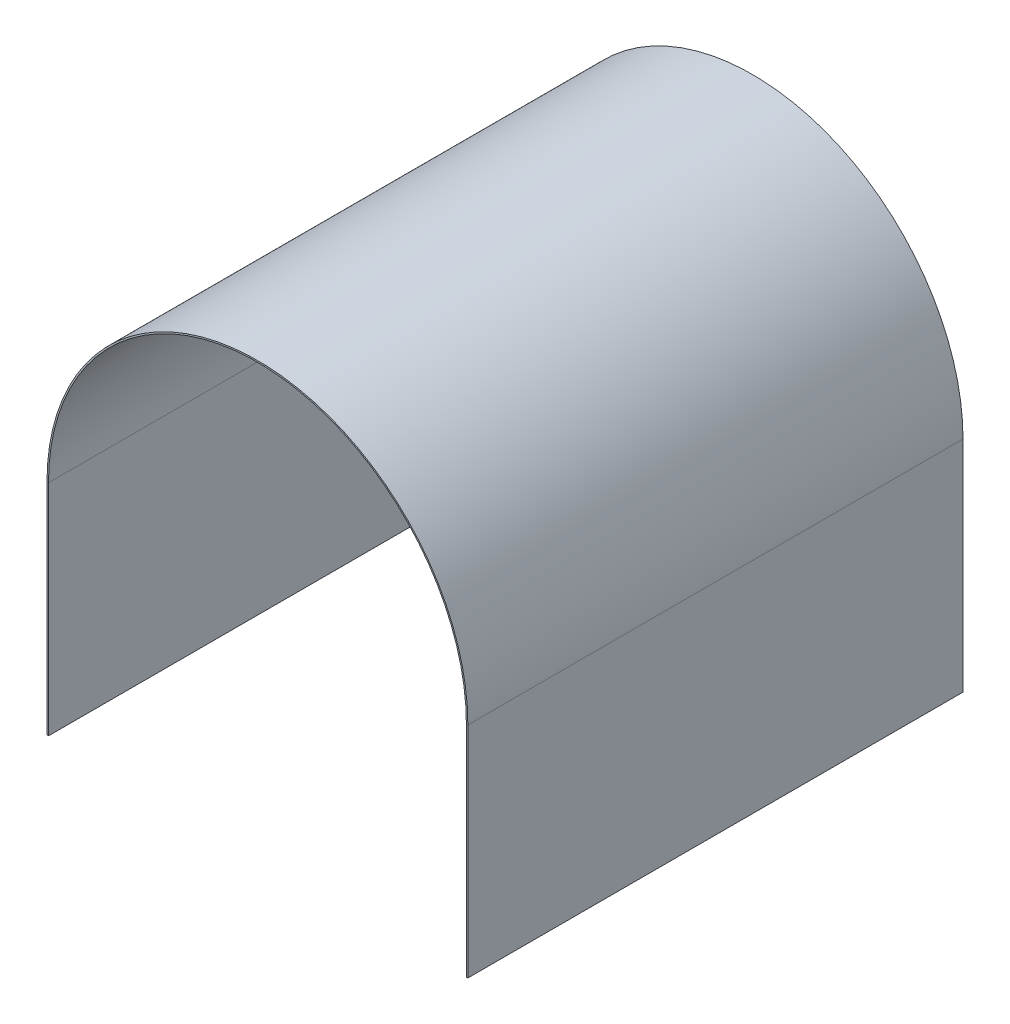
ISO-10303-21;
HEADER;
FILE_DESCRIPTION(('STEP AP214'),'2;1');
FILE_NAME('part.step','',(''),(''),'','','');
FILE_SCHEMA(('AUTOMOTIVE_DESIGN { 1 0 10303 214 1 1 1 1 }'));
ENDSEC;
DATA;
#1=APPLICATION_CONTEXT('core data for automotive mechanical design processes');
#2=APPLICATION_PROTOCOL_DEFINITION('international standard','automotive_design',2000,#1);
#3=PRODUCT_CONTEXT('',#1,'mechanical');
#4=PRODUCT('Part','Part','',(#3));
#5=PRODUCT_RELATED_PRODUCT_CATEGORY('part','',(#4));
#6=PRODUCT_DEFINITION_FORMATION('','',#4);
#7=PRODUCT_DEFINITION_CONTEXT('part definition',#1,'design');
#8=PRODUCT_DEFINITION('design','',#6,#7);
#9=PRODUCT_DEFINITION_SHAPE('','',#8);
#10=(LENGTH_UNIT() NAMED_UNIT(*) SI_UNIT(.MILLI.,.METRE.));
#11=(NAMED_UNIT(*) PLANE_ANGLE_UNIT() SI_UNIT($,.RADIAN.));
#12=(NAMED_UNIT(*) SI_UNIT($,.STERADIAN.) SOLID_ANGLE_UNIT());
#13=UNCERTAINTY_MEASURE_WITH_UNIT(LENGTH_MEASURE(1.E-05),#10,'distance_accuracy_value','');
#14=(GEOMETRIC_REPRESENTATION_CONTEXT(3) GLOBAL_UNCERTAINTY_ASSIGNED_CONTEXT((#13)) GLOBAL_UNIT_ASSIGNED_CONTEXT((#10,
#11,#12)) REPRESENTATION_CONTEXT('',''));
#15=CARTESIAN_POINT('',(0.,0.,0.));
#16=DIRECTION('',(0.,0.,1.));
#17=DIRECTION('',(1.,0.,0.));
#18=AXIS2_PLACEMENT_3D('',#15,#16,#17);
#19=CARTESIAN_POINT('',(170.,0.,300.));
#20=DIRECTION('',(0.,0.,1.));
#21=DIRECTION('',(1.,0.,0.));
#22=AXIS2_PLACEMENT_3D('',#19,#20,#21);
#23=PLANE('',#22);
#24=DIRECTION('',(-1.,0.,0.));
#25=VECTOR('',#24,1.);
#26=CARTESIAN_POINT('',(170.,0.,300.));
#27=LINE('',#26,#25);
#28=CARTESIAN_POINT('',(170.,0.,300.));
#29=VERTEX_POINT('',#28);
#30=CARTESIAN_POINT('',(168.8,0.,300.));
#31=VERTEX_POINT('',#30);
#32=EDGE_CURVE('E13',#29,#31,#27,.T.);
#33=ORIENTED_EDGE('',*,*,#32,.F.);
#34=CARTESIAN_POINT('',(0.,0.,300.));
#35=DIRECTION('',(0.,0.,1.));
#36=DIRECTION('',(1.,0.,0.));
#37=AXIS2_PLACEMENT_3D('',#34,#35,#36);
#38=CIRCLE('',#37,170.);
#39=CARTESIAN_POINT('',(-170.,0.,300.));
#40=VERTEX_POINT('',#39);
#41=EDGE_CURVE('E169',#29,#40,#38,.T.);
#42=ORIENTED_EDGE('',*,*,#41,.T.);
#43=DIRECTION('',(-1.,0.,0.));
#44=VECTOR('',#43,1.);
#45=CARTESIAN_POINT('',(-168.8,0.,300.));
#46=LINE('',#45,#44);
#47=CARTESIAN_POINT('',(-168.8,0.,300.));
#48=VERTEX_POINT('',#47);
#49=EDGE_CURVE('E55',#48,#40,#46,.T.);
#50=ORIENTED_EDGE('',*,*,#49,.F.);
#51=CARTESIAN_POINT('',(0.,0.,300.));
#52=DIRECTION('',(0.,0.,1.));
#53=DIRECTION('',(1.,0.,0.));
#54=AXIS2_PLACEMENT_3D('',#51,#52,#53);
#55=CIRCLE('',#54,168.8);
#56=EDGE_CURVE('E158',#31,#48,#55,.T.);
#57=ORIENTED_EDGE('',*,*,#56,.F.);
#58=EDGE_LOOP('',(#33,#42,#50,#57));
#59=FACE_BOUND('',#58,.T.);
#60=ADVANCED_FACE('F48',(#59),#23,.T.);
#61=CARTESIAN_POINT('',(-168.8,0.,300.));
#62=DIRECTION('',(0.,0.,1.));
#63=DIRECTION('',(1.,0.,0.));
#64=AXIS2_PLACEMENT_3D('',#61,#62,#63);
#65=PLANE('',#64);
#66=DIRECTION('',(0.,1.,0.));
#67=VECTOR('',#66,1.);
#68=CARTESIAN_POINT('',(170.,0.,300.));
#69=LINE('',#68,#67);
#70=CARTESIAN_POINT('',(170.,-177.08,300.));
#71=VERTEX_POINT('',#70);
#72=EDGE_CURVE('E167',#71,#29,#69,.T.);
#73=ORIENTED_EDGE('',*,*,#72,.T.);
#74=ORIENTED_EDGE('',*,*,#32,.T.);
#75=DIRECTION('',(0.,1.,0.));
#76=VECTOR('',#75,1.);
#77=CARTESIAN_POINT('',(168.8,0.,300.));
#78=LINE('',#77,#76);
#79=CARTESIAN_POINT('',(168.8,-177.08,300.));
#80=VERTEX_POINT('',#79);
#81=EDGE_CURVE('E161',#80,#31,#78,.T.);
#82=ORIENTED_EDGE('',*,*,#81,.F.);
#83=DIRECTION('',(-1.,0.,0.));
#84=VECTOR('',#83,1.);
#85=CARTESIAN_POINT('',(170.,-177.08,300.));
#86=LINE('',#85,#84);
#87=EDGE_CURVE('E164',#71,#80,#86,.T.);
#88=ORIENTED_EDGE('',*,*,#87,.F.);
#89=EDGE_LOOP('',(#73,#74,#82,#88));
#90=FACE_BOUND('',#89,.T.);
#91=ADVANCED_FACE('F213',(#90),#65,.T.);
#92=CARTESIAN_POINT('',(-170.,0.,-100.));
#93=DIRECTION('',(0.,0.,-1.));
#94=DIRECTION('',(-1.,0.,0.));
#95=AXIS2_PLACEMENT_3D('',#92,#93,#94);
#96=PLANE('',#95);
#97=DIRECTION('',(1.,0.,0.));
#98=VECTOR('',#97,1.);
#99=CARTESIAN_POINT('',(-170.,0.,-100.));
#100=LINE('',#99,#98);
#101=CARTESIAN_POINT('',(-170.,0.,-100.));
#102=VERTEX_POINT('',#101);
#103=CARTESIAN_POINT('',(-168.8,0.,-100.));
#104=VERTEX_POINT('',#103);
#105=EDGE_CURVE('E187',#102,#104,#100,.T.);
#106=ORIENTED_EDGE('',*,*,#105,.F.);
#107=CARTESIAN_POINT('',(0.,0.,-100.));
#108=DIRECTION('',(0.,0.,1.));
#109=DIRECTION('',(1.,0.,0.));
#110=AXIS2_PLACEMENT_3D('',#107,#108,#109);
#111=CIRCLE('',#110,170.);
#112=CARTESIAN_POINT('',(170.,0.,-100.));
#113=VERTEX_POINT('',#112);
#114=EDGE_CURVE('E150',#113,#102,#111,.T.);
#115=ORIENTED_EDGE('',*,*,#114,.F.);
#116=DIRECTION('',(1.,0.,0.));
#117=VECTOR('',#116,1.);
#118=CARTESIAN_POINT('',(168.8,0.,-100.));
#119=LINE('',#118,#117);
#120=CARTESIAN_POINT('',(168.8,0.,-100.));
#121=VERTEX_POINT('',#120);
#122=EDGE_CURVE('E119',#121,#113,#119,.T.);
#123=ORIENTED_EDGE('',*,*,#122,.F.);
#124=CARTESIAN_POINT('',(0.,0.,-100.));
#125=DIRECTION('',(0.,0.,1.));
#126=DIRECTION('',(1.,0.,0.));
#127=AXIS2_PLACEMENT_3D('',#124,#125,#126);
#128=CIRCLE('',#127,168.8);
#129=EDGE_CURVE('E138',#121,#104,#128,.T.);
#130=ORIENTED_EDGE('',*,*,#129,.T.);
#131=EDGE_LOOP('',(#106,#115,#123,#130));
#132=FACE_BOUND('',#131,.T.);
#133=ADVANCED_FACE('F196',(#132),#96,.T.);
#134=CARTESIAN_POINT('',(168.8,0.,-100.));
#135=DIRECTION('',(0.,0.,-1.));
#136=DIRECTION('',(-1.,0.,0.));
#137=AXIS2_PLACEMENT_3D('',#134,#135,#136);
#138=PLANE('',#137);
#139=DIRECTION('',(0.,-1.,0.));
#140=VECTOR('',#139,1.);
#141=CARTESIAN_POINT('',(-170.,0.,-100.));
#142=LINE('',#141,#140);
#143=CARTESIAN_POINT('',(-170.,-177.08,-100.));
#144=VERTEX_POINT('',#143);
#145=EDGE_CURVE('E126',#102,#144,#142,.T.);
#146=ORIENTED_EDGE('',*,*,#145,.F.);
#147=ORIENTED_EDGE('',*,*,#105,.T.);
#148=DIRECTION('',(0.,-1.,0.));
#149=VECTOR('',#148,1.);
#150=CARTESIAN_POINT('',(-168.8,0.,-100.));
#151=LINE('',#150,#149);
#152=CARTESIAN_POINT('',(-168.8,-177.08,-100.));
#153=VERTEX_POINT('',#152);
#154=EDGE_CURVE('E129',#104,#153,#151,.T.);
#155=ORIENTED_EDGE('',*,*,#154,.T.);
#156=DIRECTION('',(-1.,0.,0.));
#157=VECTOR('',#156,1.);
#158=CARTESIAN_POINT('',(-168.8,-177.08,-100.));
#159=LINE('',#158,#157);
#160=EDGE_CURVE('E113',#153,#144,#159,.T.);
#161=ORIENTED_EDGE('',*,*,#160,.T.);
#162=EDGE_LOOP('',(#146,#147,#155,#161));
#163=FACE_BOUND('',#162,.T.);
#164=ADVANCED_FACE('F125',(#163),#138,.T.);
#165=CARTESIAN_POINT('',(-170.,0.,300.));
#166=DIRECTION('',(1.,0.,0.));
#167=DIRECTION('',(0.,1.,0.));
#168=AXIS2_PLACEMENT_3D('',#165,#166,#167);
#169=PLANE('',#168);
#170=DIRECTION('',(0.,0.,-1.));
#171=VECTOR('',#170,1.);
#172=CARTESIAN_POINT('',(-170.,0.,300.));
#173=LINE('',#172,#171);
#174=EDGE_CURVE('E134',#40,#102,#173,.T.);
#175=ORIENTED_EDGE('',*,*,#174,.T.);
#176=ORIENTED_EDGE('',*,*,#145,.T.);
#177=DIRECTION('',(0.,0.,-1.));
#178=VECTOR('',#177,1.);
#179=CARTESIAN_POINT('',(-170.,-177.08,300.));
#180=LINE('',#179,#178);
#181=CARTESIAN_POINT('',(-170.,-177.08,300.));
#182=VERTEX_POINT('',#181);
#183=EDGE_CURVE('E110',#182,#144,#180,.T.);
#184=ORIENTED_EDGE('',*,*,#183,.F.);
#185=DIRECTION('',(0.,-1.,0.));
#186=VECTOR('',#185,1.);
#187=CARTESIAN_POINT('',(-170.,0.,300.));
#188=LINE('',#187,#186);
#189=EDGE_CURVE('E152',#40,#182,#188,.T.);
#190=ORIENTED_EDGE('',*,*,#189,.F.);
#191=EDGE_LOOP('',(#175,#176,#184,#190));
#192=FACE_BOUND('',#191,.T.);
#193=ADVANCED_FACE('F132',(#192),#169,.F.);
#194=CARTESIAN_POINT('',(-168.8,-177.08,300.));
#195=DIRECTION('',(0.,-1.,0.));
#196=DIRECTION('',(0.,0.,-1.));
#197=AXIS2_PLACEMENT_3D('',#194,#195,#196);
#198=PLANE('',#197);
#199=ORIENTED_EDGE('',*,*,#183,.T.);
#200=ORIENTED_EDGE('',*,*,#160,.F.);
#201=DIRECTION('',(0.,0.,-1.));
#202=VECTOR('',#201,1.);
#203=CARTESIAN_POINT('',(-168.8,-177.08,300.));
#204=LINE('',#203,#202);
#205=CARTESIAN_POINT('',(-168.8,-177.08,300.));
#206=VERTEX_POINT('',#205);
#207=EDGE_CURVE('E120',#206,#153,#204,.T.);
#208=ORIENTED_EDGE('',*,*,#207,.F.);
#209=DIRECTION('',(-1.,0.,0.));
#210=VECTOR('',#209,1.);
#211=CARTESIAN_POINT('',(-168.8,-177.08,300.));
#212=LINE('',#211,#210);
#213=EDGE_CURVE('E115',#206,#182,#212,.T.);
#214=ORIENTED_EDGE('',*,*,#213,.T.);
#215=EDGE_LOOP('',(#199,#200,#208,#214));
#216=FACE_BOUND('',#215,.T.);
#217=ADVANCED_FACE('F112',(#216),#198,.T.);
#218=CARTESIAN_POINT('',(-168.8,0.,300.));
#219=DIRECTION('',(1.,0.,0.));
#220=DIRECTION('',(0.,1.,0.));
#221=AXIS2_PLACEMENT_3D('',#218,#219,#220);
#222=PLANE('',#221);
#223=ORIENTED_EDGE('',*,*,#207,.T.);
#224=ORIENTED_EDGE('',*,*,#154,.F.);
#225=DIRECTION('',(0.,0.,-1.));
#226=VECTOR('',#225,1.);
#227=CARTESIAN_POINT('',(-168.8,0.,300.));
#228=LINE('',#227,#226);
#229=EDGE_CURVE('E182',#48,#104,#228,.T.);
#230=ORIENTED_EDGE('',*,*,#229,.F.);
#231=DIRECTION('',(0.,-1.,0.));
#232=VECTOR('',#231,1.);
#233=CARTESIAN_POINT('',(-168.8,0.,300.));
#234=LINE('',#233,#232);
#235=EDGE_CURVE('E155',#48,#206,#234,.T.);
#236=ORIENTED_EDGE('',*,*,#235,.T.);
#237=EDGE_LOOP('',(#223,#224,#230,#236));
#238=FACE_BOUND('',#237,.T.);
#239=ADVANCED_FACE('F197',(#238),#222,.T.);
#240=CARTESIAN_POINT('',(0.,0.,300.));
#241=DIRECTION('',(0.,0.,-1.));
#242=DIRECTION('',(-1.,0.,0.));
#243=AXIS2_PLACEMENT_3D('',#240,#241,#242);
#244=CYLINDRICAL_SURFACE('',#243,168.8);
#245=ORIENTED_EDGE('',*,*,#229,.T.);
#246=ORIENTED_EDGE('',*,*,#129,.F.);
#247=DIRECTION('',(0.,0.,-1.));
#248=VECTOR('',#247,1.);
#249=CARTESIAN_POINT('',(168.8,0.,300.));
#250=LINE('',#249,#248);
#251=EDGE_CURVE('E179',#31,#121,#250,.T.);
#252=ORIENTED_EDGE('',*,*,#251,.F.);
#253=ORIENTED_EDGE('',*,*,#56,.T.);
#254=EDGE_LOOP('',(#245,#246,#252,#253));
#255=FACE_BOUND('',#254,.T.);
#256=ADVANCED_FACE('F193',(#255),#244,.F.);
#257=CARTESIAN_POINT('',(168.8,0.,300.));
#258=DIRECTION('',(-1.,0.,0.));
#259=DIRECTION('',(0.,-1.,0.));
#260=AXIS2_PLACEMENT_3D('',#257,#258,#259);
#261=PLANE('',#260);
#262=ORIENTED_EDGE('',*,*,#251,.T.);
#263=DIRECTION('',(0.,1.,0.));
#264=VECTOR('',#263,1.);
#265=CARTESIAN_POINT('',(168.8,0.,-100.));
#266=LINE('',#265,#264);
#267=CARTESIAN_POINT('',(168.8,-177.08,-100.));
#268=VERTEX_POINT('',#267);
#269=EDGE_CURVE('E141',#268,#121,#266,.T.);
#270=ORIENTED_EDGE('',*,*,#269,.F.);
#271=DIRECTION('',(0.,0.,-1.));
#272=VECTOR('',#271,1.);
#273=CARTESIAN_POINT('',(168.8,-177.08,300.));
#274=LINE('',#273,#272);
#275=EDGE_CURVE('E177',#80,#268,#274,.T.);
#276=ORIENTED_EDGE('',*,*,#275,.F.);
#277=ORIENTED_EDGE('',*,*,#81,.T.);
#278=EDGE_LOOP('',(#262,#270,#276,#277));
#279=FACE_BOUND('',#278,.T.);
#280=ADVANCED_FACE('F233',(#279),#261,.T.);
#281=CARTESIAN_POINT('',(170.,-177.08,300.));
#282=DIRECTION('',(0.,-1.,0.));
#283=DIRECTION('',(0.,0.,-1.));
#284=AXIS2_PLACEMENT_3D('',#281,#282,#283);
#285=PLANE('',#284);
#286=ORIENTED_EDGE('',*,*,#275,.T.);
#287=DIRECTION('',(-1.,0.,0.));
#288=VECTOR('',#287,1.);
#289=CARTESIAN_POINT('',(170.,-177.08,-100.));
#290=LINE('',#289,#288);
#291=CARTESIAN_POINT('',(170.,-177.08,-100.));
#292=VERTEX_POINT('',#291);
#293=EDGE_CURVE('E144',#292,#268,#290,.T.);
#294=ORIENTED_EDGE('',*,*,#293,.F.);
#295=DIRECTION('',(0.,0.,-1.));
#296=VECTOR('',#295,1.);
#297=CARTESIAN_POINT('',(170.,-177.08,300.));
#298=LINE('',#297,#296);
#299=EDGE_CURVE('E175',#71,#292,#298,.T.);
#300=ORIENTED_EDGE('',*,*,#299,.F.);
#301=ORIENTED_EDGE('',*,*,#87,.T.);
#302=EDGE_LOOP('',(#286,#294,#300,#301));
#303=FACE_BOUND('',#302,.T.);
#304=ADVANCED_FACE('F236',(#303),#285,.T.);
#305=CARTESIAN_POINT('',(170.,0.,300.));
#306=DIRECTION('',(-1.,0.,0.));
#307=DIRECTION('',(0.,-1.,0.));
#308=AXIS2_PLACEMENT_3D('',#305,#306,#307);
#309=PLANE('',#308);
#310=ORIENTED_EDGE('',*,*,#299,.T.);
#311=DIRECTION('',(0.,1.,0.));
#312=VECTOR('',#311,1.);
#313=CARTESIAN_POINT('',(170.,0.,-100.));
#314=LINE('',#313,#312);
#315=EDGE_CURVE('E147',#292,#113,#314,.T.);
#316=ORIENTED_EDGE('',*,*,#315,.T.);
#317=DIRECTION('',(0.,0.,-1.));
#318=VECTOR('',#317,1.);
#319=CARTESIAN_POINT('',(170.,0.,300.));
#320=LINE('',#319,#318);
#321=EDGE_CURVE('E172',#29,#113,#320,.T.);
#322=ORIENTED_EDGE('',*,*,#321,.F.);
#323=ORIENTED_EDGE('',*,*,#72,.F.);
#324=EDGE_LOOP('',(#310,#316,#322,#323));
#325=FACE_BOUND('',#324,.T.);
#326=ADVANCED_FACE('F209',(#325),#309,.F.);
#327=CARTESIAN_POINT('',(0.,0.,300.));
#328=DIRECTION('',(0.,0.,-1.));
#329=DIRECTION('',(-1.,0.,0.));
#330=AXIS2_PLACEMENT_3D('',#327,#328,#329);
#331=CYLINDRICAL_SURFACE('',#330,170.);
#332=ORIENTED_EDGE('',*,*,#321,.T.);
#333=ORIENTED_EDGE('',*,*,#114,.T.);
#334=ORIENTED_EDGE('',*,*,#174,.F.);
#335=ORIENTED_EDGE('',*,*,#41,.F.);
#336=EDGE_LOOP('',(#332,#333,#334,#335));
#337=FACE_BOUND('',#336,.T.);
#338=ADVANCED_FACE('F201',(#337),#331,.T.);
#339=CARTESIAN_POINT('',(0.,0.,300.));
#340=DIRECTION('',(0.,0.,1.));
#341=DIRECTION('',(1.,0.,0.));
#342=AXIS2_PLACEMENT_3D('',#339,#340,#341);
#343=PLANE('',#342);
#344=ORIENTED_EDGE('',*,*,#189,.T.);
#345=ORIENTED_EDGE('',*,*,#213,.F.);
#346=ORIENTED_EDGE('',*,*,#235,.F.);
#347=ORIENTED_EDGE('',*,*,#49,.T.);
#348=EDGE_LOOP('',(#344,#345,#346,#347));
#349=FACE_BOUND('',#348,.T.);
#350=ADVANCED_FACE('F198',(#349),#343,.T.);
#351=CARTESIAN_POINT('',(0.,0.,-100.));
#352=DIRECTION('',(0.,0.,1.));
#353=DIRECTION('',(1.,0.,0.));
#354=AXIS2_PLACEMENT_3D('',#351,#352,#353);
#355=PLANE('',#354);
#356=ORIENTED_EDGE('',*,*,#269,.T.);
#357=ORIENTED_EDGE('',*,*,#122,.T.);
#358=ORIENTED_EDGE('',*,*,#315,.F.);
#359=ORIENTED_EDGE('',*,*,#293,.T.);
#360=EDGE_LOOP('',(#356,#357,#358,#359));
#361=FACE_BOUND('',#360,.T.);
#362=ADVANCED_FACE('F200',(#361),#355,.F.);
#363=CLOSED_SHELL('',(#60,#91,#133,#164,#193,#217,#239,#256,#280,#304,#326,#338,#350,#362));
#364=MANIFOLD_SOLID_BREP('B2',#363);
#365=ADVANCED_BREP_SHAPE_REPRESENTATION('',(#18,#364),#14);
#366=SHAPE_DEFINITION_REPRESENTATION(#9,#365);
ENDSEC;
END-ISO-10303-21;
